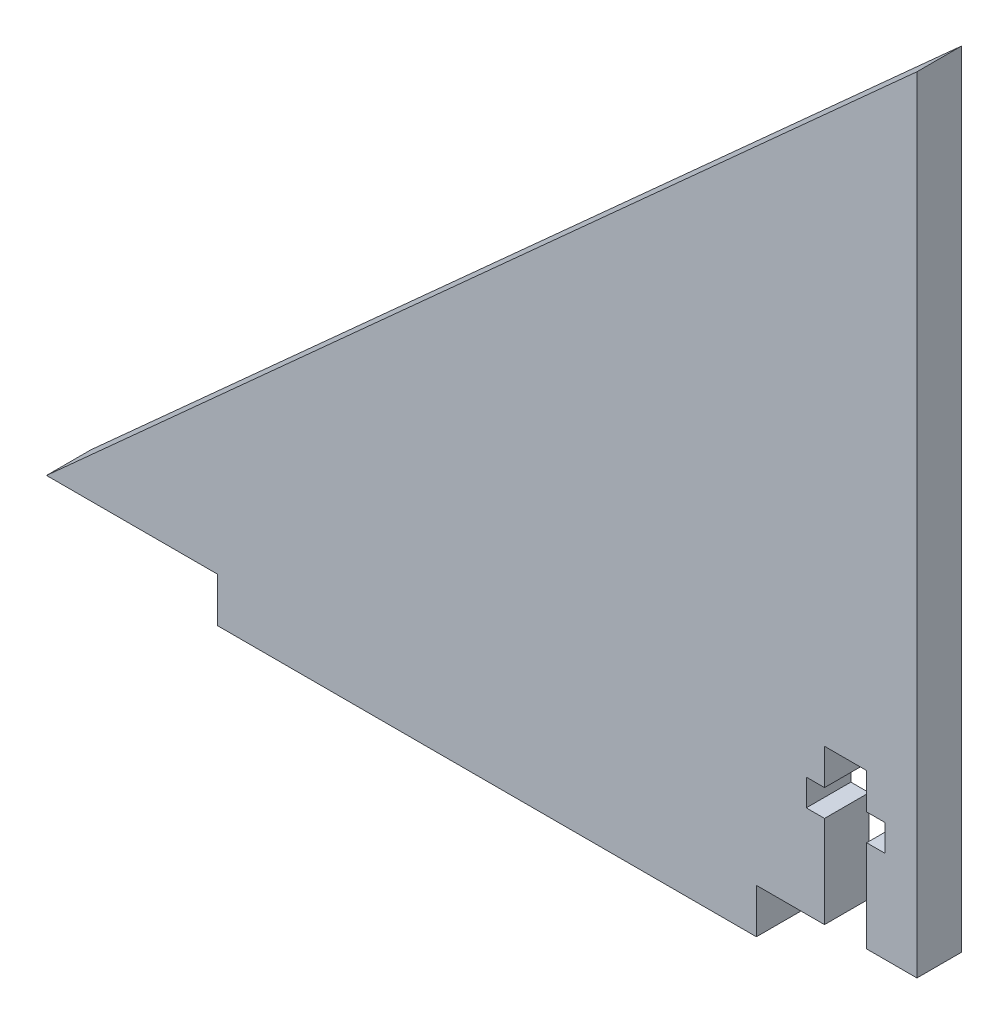
ISO-10303-21;
HEADER;
FILE_DESCRIPTION(('STEP AP214'),'2;1');
FILE_NAME('part.step','',(''),(''),'','','');
FILE_SCHEMA(('AUTOMOTIVE_DESIGN { 1 0 10303 214 1 1 1 1 }'));
ENDSEC;
DATA;
#1=APPLICATION_CONTEXT('core data for automotive mechanical design processes');
#2=APPLICATION_PROTOCOL_DEFINITION('international standard','automotive_design',2000,#1);
#3=PRODUCT_CONTEXT('',#1,'mechanical');
#4=PRODUCT('Part','Part','',(#3));
#5=PRODUCT_RELATED_PRODUCT_CATEGORY('part','',(#4));
#6=PRODUCT_DEFINITION_FORMATION('','',#4);
#7=PRODUCT_DEFINITION_CONTEXT('part definition',#1,'design');
#8=PRODUCT_DEFINITION('design','',#6,#7);
#9=PRODUCT_DEFINITION_SHAPE('','',#8);
#10=(LENGTH_UNIT() NAMED_UNIT(*) SI_UNIT(.MILLI.,.METRE.));
#11=(NAMED_UNIT(*) PLANE_ANGLE_UNIT() SI_UNIT($,.RADIAN.));
#12=(NAMED_UNIT(*) SI_UNIT($,.STERADIAN.) SOLID_ANGLE_UNIT());
#13=UNCERTAINTY_MEASURE_WITH_UNIT(LENGTH_MEASURE(1.E-05),#10,'distance_accuracy_value','');
#14=(GEOMETRIC_REPRESENTATION_CONTEXT(3) GLOBAL_UNCERTAINTY_ASSIGNED_CONTEXT((#13)) GLOBAL_UNIT_ASSIGNED_CONTEXT((#10,
#11,#12)) REPRESENTATION_CONTEXT('',''));
#15=CARTESIAN_POINT('',(0.,0.,0.));
#16=DIRECTION('',(0.,0.,1.));
#17=DIRECTION('',(1.,0.,0.));
#18=AXIS2_PLACEMENT_3D('',#15,#16,#17);
#19=CARTESIAN_POINT('',(0.,0.,3.175));
#20=DIRECTION('',(0.,1.,0.));
#21=DIRECTION('',(0.,0.,1.));
#22=AXIS2_PLACEMENT_3D('',#19,#20,#21);
#23=PLANE('',#22);
#24=DIRECTION('',(1.,0.,0.));
#25=VECTOR('',#24,1.);
#26=CARTESIAN_POINT('',(0.,0.,3.175));
#27=LINE('',#26,#25);
#28=CARTESIAN_POINT('',(-3.58,0.,3.175));
#29=VERTEX_POINT('',#28);
#30=CARTESIAN_POINT('',(0.,0.,3.175));
#31=VERTEX_POINT('',#30);
#32=EDGE_CURVE('E95',#29,#31,#27,.T.);
#33=ORIENTED_EDGE('',*,*,#32,.F.);
#34=DIRECTION('',(0.,0.,1.));
#35=VECTOR('',#34,1.);
#36=CARTESIAN_POINT('',(-3.58,0.,0.));
#37=LINE('',#36,#35);
#38=CARTESIAN_POINT('',(-3.58,0.,0.));
#39=VERTEX_POINT('',#38);
#40=EDGE_CURVE('E196',#39,#29,#37,.T.);
#41=ORIENTED_EDGE('',*,*,#40,.F.);
#42=DIRECTION('',(1.,0.,0.));
#43=VECTOR('',#42,1.);
#44=CARTESIAN_POINT('',(0.,0.,0.));
#45=LINE('',#44,#43);
#46=CARTESIAN_POINT('',(0.,0.,0.));
#47=VERTEX_POINT('',#46);
#48=EDGE_CURVE('E141',#39,#47,#45,.T.);
#49=ORIENTED_EDGE('',*,*,#48,.T.);
#50=DIRECTION('',(0.,0.,-1.));
#51=VECTOR('',#50,1.);
#52=CARTESIAN_POINT('',(0.,0.,3.175));
#53=LINE('',#52,#51);
#54=EDGE_CURVE('E11',#31,#47,#53,.T.);
#55=ORIENTED_EDGE('',*,*,#54,.F.);
#56=EDGE_LOOP('',(#33,#41,#49,#55));
#57=FACE_BOUND('',#56,.T.);
#58=ADVANCED_FACE('F33',(#57),#23,.F.);
#59=CARTESIAN_POINT('',(-11.43,0.,0.));
#60=VERTEX_POINT('',#59);
#61=CARTESIAN_POINT('',(-6.58,0.,0.));
#62=VERTEX_POINT('',#61);
#63=EDGE_CURVE('E137',#60,#62,#45,.T.);
#64=ORIENTED_EDGE('',*,*,#63,.T.);
#65=DIRECTION('',(0.,0.,1.));
#66=VECTOR('',#65,1.);
#67=CARTESIAN_POINT('',(-6.58,0.,0.));
#68=LINE('',#67,#66);
#69=CARTESIAN_POINT('',(-6.58,0.,3.175));
#70=VERTEX_POINT('',#69);
#71=EDGE_CURVE('E193',#62,#70,#68,.T.);
#72=ORIENTED_EDGE('',*,*,#71,.T.);
#73=CARTESIAN_POINT('',(-11.43,0.,3.175));
#74=VERTEX_POINT('',#73);
#75=EDGE_CURVE('E176',#74,#70,#27,.T.);
#76=ORIENTED_EDGE('',*,*,#75,.F.);
#77=DIRECTION('',(0.,0.,-1.));
#78=VECTOR('',#77,1.);
#79=CARTESIAN_POINT('',(-11.43,0.,3.175));
#80=LINE('',#79,#78);
#81=EDGE_CURVE('E133',#74,#60,#80,.T.);
#82=ORIENTED_EDGE('',*,*,#81,.T.);
#83=EDGE_LOOP('',(#64,#72,#76,#82));
#84=FACE_BOUND('',#83,.T.);
#85=ADVANCED_FACE('F35',(#84),#23,.F.);
#86=CARTESIAN_POINT('',(0.,55.88,3.175));
#87=DIRECTION('',(-1.,0.,0.));
#88=DIRECTION('',(0.,-1.,0.));
#89=AXIS2_PLACEMENT_3D('',#86,#87,#88);
#90=PLANE('',#89);
#91=DIRECTION('',(0.,1.,0.));
#92=VECTOR('',#91,1.);
#93=CARTESIAN_POINT('',(0.,55.88,0.));
#94=LINE('',#93,#92);
#95=CARTESIAN_POINT('',(0.,55.88,0.));
#96=VERTEX_POINT('',#95);
#97=EDGE_CURVE('E140',#47,#96,#94,.T.);
#98=ORIENTED_EDGE('',*,*,#97,.T.);
#99=DIRECTION('',(0.,0.,-1.));
#100=VECTOR('',#99,1.);
#101=CARTESIAN_POINT('',(0.,55.88,3.175));
#102=LINE('',#101,#100);
#103=CARTESIAN_POINT('',(0.,55.88,3.175));
#104=VERTEX_POINT('',#103);
#105=EDGE_CURVE('E41',#104,#96,#102,.T.);
#106=ORIENTED_EDGE('',*,*,#105,.F.);
#107=DIRECTION('',(0.,1.,0.));
#108=VECTOR('',#107,1.);
#109=CARTESIAN_POINT('',(0.,55.88,3.175));
#110=LINE('',#109,#108);
#111=EDGE_CURVE('E172',#31,#104,#110,.T.);
#112=ORIENTED_EDGE('',*,*,#111,.F.);
#113=ORIENTED_EDGE('',*,*,#54,.T.);
#114=EDGE_LOOP('',(#98,#106,#112,#113));
#115=FACE_BOUND('',#114,.T.);
#116=ADVANCED_FACE('F365',(#115),#90,.F.);
#117=CARTESIAN_POINT('',(-61.976,0.,3.175));
#118=DIRECTION('',(0.669637121797189,-0.742688444175064,0.));
#119=DIRECTION('',(0.742688444175064,0.669637121797189,0.));
#120=AXIS2_PLACEMENT_3D('',#117,#118,#119);
#121=PLANE('',#120);
#122=DIRECTION('',(-0.742688444175064,-0.669637121797189,0.));
#123=VECTOR('',#122,1.);
#124=CARTESIAN_POINT('',(-61.976,0.,0.));
#125=LINE('',#124,#123);
#126=CARTESIAN_POINT('',(-61.976,0.,0.));
#127=VERTEX_POINT('',#126);
#128=EDGE_CURVE('E143',#96,#127,#125,.T.);
#129=ORIENTED_EDGE('',*,*,#128,.T.);
#130=DIRECTION('',(0.,0.,-1.));
#131=VECTOR('',#130,1.);
#132=CARTESIAN_POINT('',(-61.976,0.,3.175));
#133=LINE('',#132,#131);
#134=CARTESIAN_POINT('',(-61.976,0.,3.175));
#135=VERTEX_POINT('',#134);
#136=EDGE_CURVE('E154',#135,#127,#133,.T.);
#137=ORIENTED_EDGE('',*,*,#136,.F.);
#138=DIRECTION('',(-0.742688444175064,-0.669637121797189,0.));
#139=VECTOR('',#138,1.);
#140=CARTESIAN_POINT('',(-61.976,0.,3.175));
#141=LINE('',#140,#139);
#142=EDGE_CURVE('E163',#104,#135,#141,.T.);
#143=ORIENTED_EDGE('',*,*,#142,.F.);
#144=ORIENTED_EDGE('',*,*,#105,.T.);
#145=EDGE_LOOP('',(#129,#137,#143,#144));
#146=FACE_BOUND('',#145,.T.);
#147=ADVANCED_FACE('F161',(#146),#121,.F.);
#148=CARTESIAN_POINT('',(-49.784,0.,3.175));
#149=DIRECTION('',(0.,1.,0.));
#150=DIRECTION('',(-1.,0.,0.));
#151=AXIS2_PLACEMENT_3D('',#148,#149,#150);
#152=PLANE('',#151);
#153=DIRECTION('',(1.,0.,0.));
#154=VECTOR('',#153,1.);
#155=CARTESIAN_POINT('',(-49.784,0.,0.));
#156=LINE('',#155,#154);
#157=CARTESIAN_POINT('',(-49.784,0.,0.));
#158=VERTEX_POINT('',#157);
#159=EDGE_CURVE('E145',#127,#158,#156,.T.);
#160=ORIENTED_EDGE('',*,*,#159,.T.);
#161=DIRECTION('',(0.,0.,-1.));
#162=VECTOR('',#161,1.);
#163=CARTESIAN_POINT('',(-49.784,0.,3.175));
#164=LINE('',#163,#162);
#165=CARTESIAN_POINT('',(-49.784,0.,3.175));
#166=VERTEX_POINT('',#165);
#167=EDGE_CURVE('E128',#166,#158,#164,.T.);
#168=ORIENTED_EDGE('',*,*,#167,.F.);
#169=DIRECTION('',(1.,0.,0.));
#170=VECTOR('',#169,1.);
#171=CARTESIAN_POINT('',(-49.784,0.,3.175));
#172=LINE('',#171,#170);
#173=EDGE_CURVE('E116',#135,#166,#172,.T.);
#174=ORIENTED_EDGE('',*,*,#173,.F.);
#175=ORIENTED_EDGE('',*,*,#136,.T.);
#176=EDGE_LOOP('',(#160,#168,#174,#175));
#177=FACE_BOUND('',#176,.T.);
#178=ADVANCED_FACE('F171',(#177),#152,.F.);
#179=CARTESIAN_POINT('',(-49.784,0.,3.175));
#180=DIRECTION('',(1.,0.,0.));
#181=DIRECTION('',(0.,0.,-1.));
#182=AXIS2_PLACEMENT_3D('',#179,#180,#181);
#183=PLANE('',#182);
#184=DIRECTION('',(0.,-1.,0.));
#185=VECTOR('',#184,1.);
#186=CARTESIAN_POINT('',(-49.784,0.,0.));
#187=LINE('',#186,#185);
#188=CARTESIAN_POINT('',(-49.784,-3.175,0.));
#189=VERTEX_POINT('',#188);
#190=EDGE_CURVE('E125',#158,#189,#187,.T.);
#191=ORIENTED_EDGE('',*,*,#190,.T.);
#192=DIRECTION('',(0.,0.,-1.));
#193=VECTOR('',#192,1.);
#194=CARTESIAN_POINT('',(-49.784,-3.175,3.175));
#195=LINE('',#194,#193);
#196=CARTESIAN_POINT('',(-49.784,-3.175,3.175));
#197=VERTEX_POINT('',#196);
#198=EDGE_CURVE('E122',#197,#189,#195,.T.);
#199=ORIENTED_EDGE('',*,*,#198,.F.);
#200=DIRECTION('',(0.,-1.,0.));
#201=VECTOR('',#200,1.);
#202=CARTESIAN_POINT('',(-49.784,0.,3.175));
#203=LINE('',#202,#201);
#204=EDGE_CURVE('E109',#166,#197,#203,.T.);
#205=ORIENTED_EDGE('',*,*,#204,.F.);
#206=ORIENTED_EDGE('',*,*,#167,.T.);
#207=EDGE_LOOP('',(#191,#199,#205,#206));
#208=FACE_BOUND('',#207,.T.);
#209=ADVANCED_FACE('F123',(#208),#183,.F.);
#210=CARTESIAN_POINT('',(-49.784,-3.175,3.175));
#211=DIRECTION('',(0.,1.,0.));
#212=DIRECTION('',(0.,0.,1.));
#213=AXIS2_PLACEMENT_3D('',#210,#211,#212);
#214=PLANE('',#213);
#215=DIRECTION('',(1.,0.,0.));
#216=VECTOR('',#215,1.);
#217=CARTESIAN_POINT('',(-49.784,-3.175,0.));
#218=LINE('',#217,#216);
#219=CARTESIAN_POINT('',(-11.43,-3.175,0.));
#220=VERTEX_POINT('',#219);
#221=EDGE_CURVE('E148',#189,#220,#218,.T.);
#222=ORIENTED_EDGE('',*,*,#221,.T.);
#223=DIRECTION('',(0.,0.,-1.));
#224=VECTOR('',#223,1.);
#225=CARTESIAN_POINT('',(-11.43,-3.175,3.175));
#226=LINE('',#225,#224);
#227=CARTESIAN_POINT('',(-11.43,-3.175,3.175));
#228=VERTEX_POINT('',#227);
#229=EDGE_CURVE('E129',#228,#220,#226,.T.);
#230=ORIENTED_EDGE('',*,*,#229,.F.);
#231=DIRECTION('',(1.,0.,0.));
#232=VECTOR('',#231,1.);
#233=CARTESIAN_POINT('',(-49.784,-3.175,3.175));
#234=LINE('',#233,#232);
#235=EDGE_CURVE('E113',#197,#228,#234,.T.);
#236=ORIENTED_EDGE('',*,*,#235,.F.);
#237=ORIENTED_EDGE('',*,*,#198,.T.);
#238=EDGE_LOOP('',(#222,#230,#236,#237));
#239=FACE_BOUND('',#238,.T.);
#240=ADVANCED_FACE('F131',(#239),#214,.F.);
#241=CARTESIAN_POINT('',(-11.43,0.,3.175));
#242=DIRECTION('',(-1.,0.,0.));
#243=DIRECTION('',(0.,0.,1.));
#244=AXIS2_PLACEMENT_3D('',#241,#242,#243);
#245=PLANE('',#244);
#246=DIRECTION('',(0.,1.,0.));
#247=VECTOR('',#246,1.);
#248=CARTESIAN_POINT('',(-11.43,0.,0.));
#249=LINE('',#248,#247);
#250=EDGE_CURVE('E87',#220,#60,#249,.T.);
#251=ORIENTED_EDGE('',*,*,#250,.T.);
#252=ORIENTED_EDGE('',*,*,#81,.F.);
#253=DIRECTION('',(0.,1.,0.));
#254=VECTOR('',#253,1.);
#255=CARTESIAN_POINT('',(-11.43,0.,3.175));
#256=LINE('',#255,#254);
#257=EDGE_CURVE('E57',#228,#74,#256,.T.);
#258=ORIENTED_EDGE('',*,*,#257,.F.);
#259=ORIENTED_EDGE('',*,*,#229,.T.);
#260=EDGE_LOOP('',(#251,#252,#258,#259));
#261=FACE_BOUND('',#260,.T.);
#262=ADVANCED_FACE('F383',(#261),#245,.F.);
#263=CARTESIAN_POINT('',(0.,0.,3.175));
#264=DIRECTION('',(0.,0.,1.));
#265=DIRECTION('',(1.,0.,0.));
#266=AXIS2_PLACEMENT_3D('',#263,#264,#265);
#267=PLANE('',#266);
#268=DIRECTION('',(0.,1.,0.));
#269=VECTOR('',#268,1.);
#270=CARTESIAN_POINT('',(-3.58,6.54999999999992,3.175));
#271=LINE('',#270,#269);
#272=CARTESIAN_POINT('',(-3.58,6.54999999999992,3.175));
#273=VERTEX_POINT('',#272);
#274=EDGE_CURVE('E227',#29,#273,#271,.T.);
#275=ORIENTED_EDGE('',*,*,#274,.F.);
#276=ORIENTED_EDGE('',*,*,#32,.T.);
#277=ORIENTED_EDGE('',*,*,#111,.T.);
#278=ORIENTED_EDGE('',*,*,#142,.T.);
#279=ORIENTED_EDGE('',*,*,#173,.T.);
#280=ORIENTED_EDGE('',*,*,#204,.T.);
#281=ORIENTED_EDGE('',*,*,#235,.T.);
#282=ORIENTED_EDGE('',*,*,#257,.T.);
#283=ORIENTED_EDGE('',*,*,#75,.T.);
#284=DIRECTION('',(0.,-1.,0.));
#285=VECTOR('',#284,1.);
#286=CARTESIAN_POINT('',(-6.58,6.54999999999992,3.175));
#287=LINE('',#286,#285);
#288=CARTESIAN_POINT('',(-6.58,6.54999999999992,3.175));
#289=VERTEX_POINT('',#288);
#290=EDGE_CURVE('E230',#289,#70,#287,.T.);
#291=ORIENTED_EDGE('',*,*,#290,.F.);
#292=DIRECTION('',(1.,0.,0.));
#293=VECTOR('',#292,1.);
#294=CARTESIAN_POINT('',(-7.88,6.54999999999992,3.175));
#295=LINE('',#294,#293);
#296=CARTESIAN_POINT('',(-7.88,6.54999999999992,3.175));
#297=VERTEX_POINT('',#296);
#298=EDGE_CURVE('E233',#297,#289,#295,.T.);
#299=ORIENTED_EDGE('',*,*,#298,.F.);
#300=DIRECTION('',(0.,-1.,0.));
#301=VECTOR('',#300,1.);
#302=CARTESIAN_POINT('',(-7.88,6.54999999999992,3.175));
#303=LINE('',#302,#301);
#304=CARTESIAN_POINT('',(-7.88,8.44999999999992,3.175));
#305=VERTEX_POINT('',#304);
#306=EDGE_CURVE('E236',#305,#297,#303,.T.);
#307=ORIENTED_EDGE('',*,*,#306,.F.);
#308=DIRECTION('',(-1.,0.,0.));
#309=VECTOR('',#308,1.);
#310=CARTESIAN_POINT('',(-7.88,8.44999999999992,3.175));
#311=LINE('',#310,#309);
#312=CARTESIAN_POINT('',(-6.58,8.44999999999992,3.175));
#313=VERTEX_POINT('',#312);
#314=EDGE_CURVE('E239',#313,#305,#311,.T.);
#315=ORIENTED_EDGE('',*,*,#314,.F.);
#316=DIRECTION('',(0.,-1.,0.));
#317=VECTOR('',#316,1.);
#318=CARTESIAN_POINT('',(-6.58,11.,3.175));
#319=LINE('',#318,#317);
#320=CARTESIAN_POINT('',(-6.58,11.,3.175));
#321=VERTEX_POINT('',#320);
#322=EDGE_CURVE('E242',#321,#313,#319,.T.);
#323=ORIENTED_EDGE('',*,*,#322,.F.);
#324=DIRECTION('',(-1.,0.,0.));
#325=VECTOR('',#324,1.);
#326=CARTESIAN_POINT('',(-3.58,11.,3.175));
#327=LINE('',#326,#325);
#328=CARTESIAN_POINT('',(-3.58,11.,3.175));
#329=VERTEX_POINT('',#328);
#330=EDGE_CURVE('E245',#329,#321,#327,.T.);
#331=ORIENTED_EDGE('',*,*,#330,.F.);
#332=DIRECTION('',(0.,1.,0.));
#333=VECTOR('',#332,1.);
#334=CARTESIAN_POINT('',(-3.58,11.,3.175));
#335=LINE('',#334,#333);
#336=CARTESIAN_POINT('',(-3.58,8.44999999999992,3.175));
#337=VERTEX_POINT('',#336);
#338=EDGE_CURVE('E214',#337,#329,#335,.T.);
#339=ORIENTED_EDGE('',*,*,#338,.F.);
#340=DIRECTION('',(-1.,0.,0.));
#341=VECTOR('',#340,1.);
#342=CARTESIAN_POINT('',(-3.58,8.44999999999992,3.175));
#343=LINE('',#342,#341);
#344=CARTESIAN_POINT('',(-2.28,8.44999999999992,3.175));
#345=VERTEX_POINT('',#344);
#346=EDGE_CURVE('E218',#345,#337,#343,.T.);
#347=ORIENTED_EDGE('',*,*,#346,.F.);
#348=DIRECTION('',(0.,1.,0.));
#349=VECTOR('',#348,1.);
#350=CARTESIAN_POINT('',(-2.28,6.54999999999992,3.175));
#351=LINE('',#350,#349);
#352=CARTESIAN_POINT('',(-2.28,6.54999999999992,3.175));
#353=VERTEX_POINT('',#352);
#354=EDGE_CURVE('E221',#353,#345,#351,.T.);
#355=ORIENTED_EDGE('',*,*,#354,.F.);
#356=DIRECTION('',(1.,0.,0.));
#357=VECTOR('',#356,1.);
#358=CARTESIAN_POINT('',(-3.58,6.54999999999992,3.175));
#359=LINE('',#358,#357);
#360=EDGE_CURVE('E224',#273,#353,#359,.T.);
#361=ORIENTED_EDGE('',*,*,#360,.F.);
#362=EDGE_LOOP('',(#275,#276,#277,#278,#279,#280,#281,#282,#283,#291,#299,#307,#315,#323,#331,
#339,#347,#355,#361));
#363=FACE_BOUND('',#362,.T.);
#364=ADVANCED_FACE('F111',(#363),#267,.T.);
#365=CARTESIAN_POINT('',(0.,0.,0.));
#366=DIRECTION('',(0.,0.,1.));
#367=DIRECTION('',(1.,0.,0.));
#368=AXIS2_PLACEMENT_3D('',#365,#366,#367);
#369=PLANE('',#368);
#370=ORIENTED_EDGE('',*,*,#48,.F.);
#371=DIRECTION('',(0.,1.,0.));
#372=VECTOR('',#371,1.);
#373=CARTESIAN_POINT('',(-3.58,6.54999999999992,0.));
#374=LINE('',#373,#372);
#375=CARTESIAN_POINT('',(-3.58,6.54999999999992,0.));
#376=VERTEX_POINT('',#375);
#377=EDGE_CURVE('E259',#39,#376,#374,.T.);
#378=ORIENTED_EDGE('',*,*,#377,.T.);
#379=DIRECTION('',(1.,0.,0.));
#380=VECTOR('',#379,1.);
#381=CARTESIAN_POINT('',(-3.58,6.54999999999992,0.));
#382=LINE('',#381,#380);
#383=CARTESIAN_POINT('',(-2.28,6.54999999999992,0.));
#384=VERTEX_POINT('',#383);
#385=EDGE_CURVE('E256',#376,#384,#382,.T.);
#386=ORIENTED_EDGE('',*,*,#385,.T.);
#387=DIRECTION('',(0.,1.,0.));
#388=VECTOR('',#387,1.);
#389=CARTESIAN_POINT('',(-2.28,6.54999999999992,0.));
#390=LINE('',#389,#388);
#391=CARTESIAN_POINT('',(-2.28,8.44999999999992,0.));
#392=VERTEX_POINT('',#391);
#393=EDGE_CURVE('E253',#384,#392,#390,.T.);
#394=ORIENTED_EDGE('',*,*,#393,.T.);
#395=DIRECTION('',(-1.,0.,0.));
#396=VECTOR('',#395,1.);
#397=CARTESIAN_POINT('',(-3.58,8.44999999999992,0.));
#398=LINE('',#397,#396);
#399=CARTESIAN_POINT('',(-3.58,8.44999999999992,0.));
#400=VERTEX_POINT('',#399);
#401=EDGE_CURVE('E250',#392,#400,#398,.T.);
#402=ORIENTED_EDGE('',*,*,#401,.T.);
#403=DIRECTION('',(0.,1.,0.));
#404=VECTOR('',#403,1.);
#405=CARTESIAN_POINT('',(-3.58,11.,0.));
#406=LINE('',#405,#404);
#407=CARTESIAN_POINT('',(-3.58,11.,0.));
#408=VERTEX_POINT('',#407);
#409=EDGE_CURVE('E182',#400,#408,#406,.T.);
#410=ORIENTED_EDGE('',*,*,#409,.T.);
#411=DIRECTION('',(-1.,0.,0.));
#412=VECTOR('',#411,1.);
#413=CARTESIAN_POINT('',(-3.58,11.,0.));
#414=LINE('',#413,#412);
#415=CARTESIAN_POINT('',(-6.58,11.,0.));
#416=VERTEX_POINT('',#415);
#417=EDGE_CURVE('E217',#408,#416,#414,.T.);
#418=ORIENTED_EDGE('',*,*,#417,.T.);
#419=DIRECTION('',(0.,-1.,0.));
#420=VECTOR('',#419,1.);
#421=CARTESIAN_POINT('',(-6.58,11.,0.));
#422=LINE('',#421,#420);
#423=CARTESIAN_POINT('',(-6.58,8.44999999999992,0.));
#424=VERTEX_POINT('',#423);
#425=EDGE_CURVE('E272',#416,#424,#422,.T.);
#426=ORIENTED_EDGE('',*,*,#425,.T.);
#427=DIRECTION('',(-1.,0.,0.));
#428=VECTOR('',#427,1.);
#429=CARTESIAN_POINT('',(-7.88,8.44999999999992,0.));
#430=LINE('',#429,#428);
#431=CARTESIAN_POINT('',(-7.88,8.44999999999992,0.));
#432=VERTEX_POINT('',#431);
#433=EDGE_CURVE('E48',#424,#432,#430,.T.);
#434=ORIENTED_EDGE('',*,*,#433,.T.);
#435=DIRECTION('',(0.,-1.,0.));
#436=VECTOR('',#435,1.);
#437=CARTESIAN_POINT('',(-7.88,6.54999999999992,0.));
#438=LINE('',#437,#436);
#439=CARTESIAN_POINT('',(-7.88,6.54999999999992,0.));
#440=VERTEX_POINT('',#439);
#441=EDGE_CURVE('E268',#432,#440,#438,.T.);
#442=ORIENTED_EDGE('',*,*,#441,.T.);
#443=DIRECTION('',(1.,0.,0.));
#444=VECTOR('',#443,1.);
#445=CARTESIAN_POINT('',(-7.88,6.54999999999992,0.));
#446=LINE('',#445,#444);
#447=CARTESIAN_POINT('',(-6.58,6.54999999999992,0.));
#448=VERTEX_POINT('',#447);
#449=EDGE_CURVE('E265',#440,#448,#446,.T.);
#450=ORIENTED_EDGE('',*,*,#449,.T.);
#451=DIRECTION('',(0.,-1.,0.));
#452=VECTOR('',#451,1.);
#453=CARTESIAN_POINT('',(-6.58,6.54999999999992,0.));
#454=LINE('',#453,#452);
#455=EDGE_CURVE('E262',#448,#62,#454,.T.);
#456=ORIENTED_EDGE('',*,*,#455,.T.);
#457=ORIENTED_EDGE('',*,*,#63,.F.);
#458=ORIENTED_EDGE('',*,*,#250,.F.);
#459=ORIENTED_EDGE('',*,*,#221,.F.);
#460=ORIENTED_EDGE('',*,*,#190,.F.);
#461=ORIENTED_EDGE('',*,*,#159,.F.);
#462=ORIENTED_EDGE('',*,*,#128,.F.);
#463=ORIENTED_EDGE('',*,*,#97,.F.);
#464=EDGE_LOOP('',(#370,#378,#386,#394,#402,#410,#418,#426,#434,#442,#450,#456,#457,#458,#459,
#460,#461,#462,#463));
#465=FACE_BOUND('',#464,.T.);
#466=ADVANCED_FACE('F169',(#465),#369,.F.);
#467=CARTESIAN_POINT('',(-3.58,11.,0.));
#468=DIRECTION('',(0.,1.,0.));
#469=DIRECTION('',(-1.,0.,0.));
#470=AXIS2_PLACEMENT_3D('',#467,#468,#469);
#471=PLANE('',#470);
#472=ORIENTED_EDGE('',*,*,#330,.T.);
#473=DIRECTION('',(0.,0.,1.));
#474=VECTOR('',#473,1.);
#475=CARTESIAN_POINT('',(-6.58,11.,0.));
#476=LINE('',#475,#474);
#477=EDGE_CURVE('E178',#416,#321,#476,.T.);
#478=ORIENTED_EDGE('',*,*,#477,.F.);
#479=ORIENTED_EDGE('',*,*,#417,.F.);
#480=DIRECTION('',(0.,0.,1.));
#481=VECTOR('',#480,1.);
#482=CARTESIAN_POINT('',(-3.58,11.,0.));
#483=LINE('',#482,#481);
#484=EDGE_CURVE('E211',#408,#329,#483,.T.);
#485=ORIENTED_EDGE('',*,*,#484,.T.);
#486=EDGE_LOOP('',(#472,#478,#479,#485));
#487=FACE_BOUND('',#486,.T.);
#488=ADVANCED_FACE('F284',(#487),#471,.F.);
#489=CARTESIAN_POINT('',(-3.58,11.,0.));
#490=DIRECTION('',(1.,0.,0.));
#491=DIRECTION('',(0.,1.,0.));
#492=AXIS2_PLACEMENT_3D('',#489,#490,#491);
#493=PLANE('',#492);
#494=ORIENTED_EDGE('',*,*,#338,.T.);
#495=ORIENTED_EDGE('',*,*,#484,.F.);
#496=ORIENTED_EDGE('',*,*,#409,.F.);
#497=DIRECTION('',(0.,0.,1.));
#498=VECTOR('',#497,1.);
#499=CARTESIAN_POINT('',(-3.58,8.44999999999992,0.));
#500=LINE('',#499,#498);
#501=EDGE_CURVE('E208',#400,#337,#500,.T.);
#502=ORIENTED_EDGE('',*,*,#501,.T.);
#503=EDGE_LOOP('',(#494,#495,#496,#502));
#504=FACE_BOUND('',#503,.T.);
#505=ADVANCED_FACE('F314',(#504),#493,.F.);
#506=CARTESIAN_POINT('',(-3.58,8.44999999999992,0.));
#507=DIRECTION('',(0.,1.,0.));
#508=DIRECTION('',(0.,0.,1.));
#509=AXIS2_PLACEMENT_3D('',#506,#507,#508);
#510=PLANE('',#509);
#511=ORIENTED_EDGE('',*,*,#346,.T.);
#512=ORIENTED_EDGE('',*,*,#501,.F.);
#513=ORIENTED_EDGE('',*,*,#401,.F.);
#514=DIRECTION('',(0.,0.,1.));
#515=VECTOR('',#514,1.);
#516=CARTESIAN_POINT('',(-2.28,8.44999999999992,0.));
#517=LINE('',#516,#515);
#518=EDGE_CURVE('E205',#392,#345,#517,.T.);
#519=ORIENTED_EDGE('',*,*,#518,.T.);
#520=EDGE_LOOP('',(#511,#512,#513,#519));
#521=FACE_BOUND('',#520,.T.);
#522=ADVANCED_FACE('F320',(#521),#510,.F.);
#523=CARTESIAN_POINT('',(-2.28,6.54999999999992,0.));
#524=DIRECTION('',(1.,0.,0.));
#525=DIRECTION('',(0.,0.,-1.));
#526=AXIS2_PLACEMENT_3D('',#523,#524,#525);
#527=PLANE('',#526);
#528=ORIENTED_EDGE('',*,*,#354,.T.);
#529=ORIENTED_EDGE('',*,*,#518,.F.);
#530=ORIENTED_EDGE('',*,*,#393,.F.);
#531=DIRECTION('',(0.,0.,1.));
#532=VECTOR('',#531,1.);
#533=CARTESIAN_POINT('',(-2.28,6.54999999999992,0.));
#534=LINE('',#533,#532);
#535=EDGE_CURVE('E202',#384,#353,#534,.T.);
#536=ORIENTED_EDGE('',*,*,#535,.T.);
#537=EDGE_LOOP('',(#528,#529,#530,#536));
#538=FACE_BOUND('',#537,.T.);
#539=ADVANCED_FACE('F356',(#538),#527,.F.);
#540=CARTESIAN_POINT('',(-3.58,6.54999999999992,0.));
#541=DIRECTION('',(0.,-1.,0.));
#542=DIRECTION('',(0.,0.,-1.));
#543=AXIS2_PLACEMENT_3D('',#540,#541,#542);
#544=PLANE('',#543);
#545=ORIENTED_EDGE('',*,*,#360,.T.);
#546=ORIENTED_EDGE('',*,*,#535,.F.);
#547=ORIENTED_EDGE('',*,*,#385,.F.);
#548=DIRECTION('',(0.,0.,1.));
#549=VECTOR('',#548,1.);
#550=CARTESIAN_POINT('',(-3.58,6.54999999999992,0.));
#551=LINE('',#550,#549);
#552=EDGE_CURVE('E199',#376,#273,#551,.T.);
#553=ORIENTED_EDGE('',*,*,#552,.T.);
#554=EDGE_LOOP('',(#545,#546,#547,#553));
#555=FACE_BOUND('',#554,.T.);
#556=ADVANCED_FACE('F359',(#555),#544,.F.);
#557=CARTESIAN_POINT('',(-3.58,6.54999999999992,0.));
#558=DIRECTION('',(1.,0.,0.));
#559=DIRECTION('',(0.,1.,0.));
#560=AXIS2_PLACEMENT_3D('',#557,#558,#559);
#561=PLANE('',#560);
#562=ORIENTED_EDGE('',*,*,#274,.T.);
#563=ORIENTED_EDGE('',*,*,#552,.F.);
#564=ORIENTED_EDGE('',*,*,#377,.F.);
#565=ORIENTED_EDGE('',*,*,#40,.T.);
#566=EDGE_LOOP('',(#562,#563,#564,#565));
#567=FACE_BOUND('',#566,.T.);
#568=ADVANCED_FACE('F438',(#567),#561,.F.);
#569=CARTESIAN_POINT('',(-6.58,6.54999999999992,0.));
#570=DIRECTION('',(-1.,0.,0.));
#571=DIRECTION('',(0.,-1.,0.));
#572=AXIS2_PLACEMENT_3D('',#569,#570,#571);
#573=PLANE('',#572);
#574=ORIENTED_EDGE('',*,*,#290,.T.);
#575=ORIENTED_EDGE('',*,*,#71,.F.);
#576=ORIENTED_EDGE('',*,*,#455,.F.);
#577=DIRECTION('',(0.,0.,1.));
#578=VECTOR('',#577,1.);
#579=CARTESIAN_POINT('',(-6.58,6.54999999999992,0.));
#580=LINE('',#579,#578);
#581=EDGE_CURVE('E190',#448,#289,#580,.T.);
#582=ORIENTED_EDGE('',*,*,#581,.T.);
#583=EDGE_LOOP('',(#574,#575,#576,#582));
#584=FACE_BOUND('',#583,.T.);
#585=ADVANCED_FACE('F447',(#584),#573,.F.);
#586=CARTESIAN_POINT('',(-7.88,6.54999999999992,0.));
#587=DIRECTION('',(0.,-1.,0.));
#588=DIRECTION('',(1.,0.,0.));
#589=AXIS2_PLACEMENT_3D('',#586,#587,#588);
#590=PLANE('',#589);
#591=ORIENTED_EDGE('',*,*,#298,.T.);
#592=ORIENTED_EDGE('',*,*,#581,.F.);
#593=ORIENTED_EDGE('',*,*,#449,.F.);
#594=DIRECTION('',(0.,0.,1.));
#595=VECTOR('',#594,1.);
#596=CARTESIAN_POINT('',(-7.88,6.54999999999992,0.));
#597=LINE('',#596,#595);
#598=EDGE_CURVE('E187',#440,#297,#597,.T.);
#599=ORIENTED_EDGE('',*,*,#598,.T.);
#600=EDGE_LOOP('',(#591,#592,#593,#599));
#601=FACE_BOUND('',#600,.T.);
#602=ADVANCED_FACE('F456',(#601),#590,.F.);
#603=CARTESIAN_POINT('',(-7.88,6.54999999999992,0.));
#604=DIRECTION('',(-1.,0.,0.));
#605=DIRECTION('',(0.,0.,1.));
#606=AXIS2_PLACEMENT_3D('',#603,#604,#605);
#607=PLANE('',#606);
#608=ORIENTED_EDGE('',*,*,#306,.T.);
#609=ORIENTED_EDGE('',*,*,#598,.F.);
#610=ORIENTED_EDGE('',*,*,#441,.F.);
#611=DIRECTION('',(0.,0.,1.));
#612=VECTOR('',#611,1.);
#613=CARTESIAN_POINT('',(-7.88,8.44999999999992,0.));
#614=LINE('',#613,#612);
#615=EDGE_CURVE('E184',#432,#305,#614,.T.);
#616=ORIENTED_EDGE('',*,*,#615,.T.);
#617=EDGE_LOOP('',(#608,#609,#610,#616));
#618=FACE_BOUND('',#617,.T.);
#619=ADVANCED_FACE('F334',(#618),#607,.F.);
#620=CARTESIAN_POINT('',(-7.88,8.44999999999992,0.));
#621=DIRECTION('',(0.,1.,0.));
#622=DIRECTION('',(0.,0.,1.));
#623=AXIS2_PLACEMENT_3D('',#620,#621,#622);
#624=PLANE('',#623);
#625=ORIENTED_EDGE('',*,*,#314,.T.);
#626=ORIENTED_EDGE('',*,*,#615,.F.);
#627=ORIENTED_EDGE('',*,*,#433,.F.);
#628=DIRECTION('',(0.,0.,1.));
#629=VECTOR('',#628,1.);
#630=CARTESIAN_POINT('',(-6.58,8.44999999999992,0.));
#631=LINE('',#630,#629);
#632=EDGE_CURVE('E181',#424,#313,#631,.T.);
#633=ORIENTED_EDGE('',*,*,#632,.T.);
#634=EDGE_LOOP('',(#625,#626,#627,#633));
#635=FACE_BOUND('',#634,.T.);
#636=ADVANCED_FACE('F328',(#635),#624,.F.);
#637=CARTESIAN_POINT('',(-6.58,11.,0.));
#638=DIRECTION('',(-1.,0.,0.));
#639=DIRECTION('',(0.,-1.,0.));
#640=AXIS2_PLACEMENT_3D('',#637,#638,#639);
#641=PLANE('',#640);
#642=ORIENTED_EDGE('',*,*,#322,.T.);
#643=ORIENTED_EDGE('',*,*,#632,.F.);
#644=ORIENTED_EDGE('',*,*,#425,.F.);
#645=ORIENTED_EDGE('',*,*,#477,.T.);
#646=EDGE_LOOP('',(#642,#643,#644,#645));
#647=FACE_BOUND('',#646,.T.);
#648=ADVANCED_FACE('F327',(#647),#641,.F.);
#649=CLOSED_SHELL('',(#58,#85,#116,#147,#178,#209,#240,#262,#364,#466,#488,#505,#522,#539,#556,
#568,#585,#602,#619,#636,#648));
#650=MANIFOLD_SOLID_BREP('B2',#649);
#651=ADVANCED_BREP_SHAPE_REPRESENTATION('',(#18,#650),#14);
#652=SHAPE_DEFINITION_REPRESENTATION(#9,#651);
ENDSEC;
END-ISO-10303-21;
